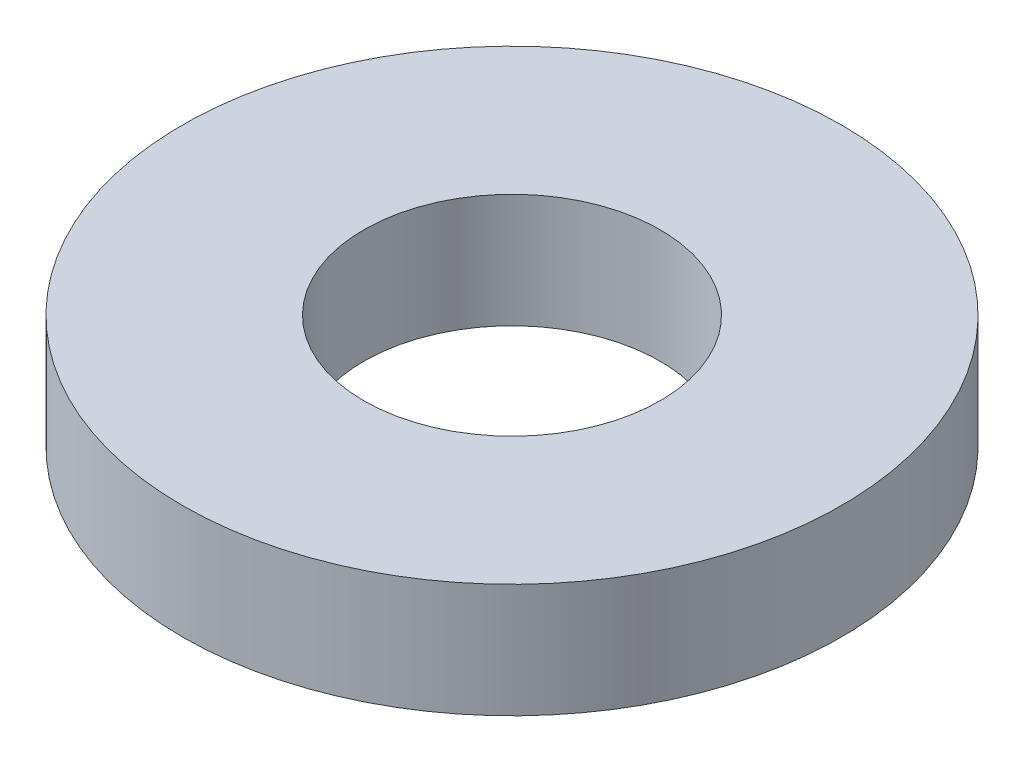
ISO-10303-21;
HEADER;
FILE_DESCRIPTION(('STEP AP214'),'2;1');
FILE_NAME('part.step','',(''),(''),'','','');
FILE_SCHEMA(('AUTOMOTIVE_DESIGN { 1 0 10303 214 1 1 1 1 }'));
ENDSEC;
DATA;
#1=APPLICATION_CONTEXT('core data for automotive mechanical design processes');
#2=APPLICATION_PROTOCOL_DEFINITION('international standard','automotive_design',2000,#1);
#3=PRODUCT_CONTEXT('',#1,'mechanical');
#4=PRODUCT('Part','Part','',(#3));
#5=PRODUCT_RELATED_PRODUCT_CATEGORY('part','',(#4));
#6=PRODUCT_DEFINITION_FORMATION('','',#4);
#7=PRODUCT_DEFINITION_CONTEXT('part definition',#1,'design');
#8=PRODUCT_DEFINITION('design','',#6,#7);
#9=PRODUCT_DEFINITION_SHAPE('','',#8);
#10=(LENGTH_UNIT() NAMED_UNIT(*) SI_UNIT(.MILLI.,.METRE.));
#11=(NAMED_UNIT(*) PLANE_ANGLE_UNIT() SI_UNIT($,.RADIAN.));
#12=(NAMED_UNIT(*) SI_UNIT($,.STERADIAN.) SOLID_ANGLE_UNIT());
#13=UNCERTAINTY_MEASURE_WITH_UNIT(LENGTH_MEASURE(1.E-05),#10,'distance_accuracy_value','');
#14=(GEOMETRIC_REPRESENTATION_CONTEXT(3) GLOBAL_UNCERTAINTY_ASSIGNED_CONTEXT((#13)) GLOBAL_UNIT_ASSIGNED_CONTEXT((#10,
#11,#12)) REPRESENTATION_CONTEXT('',''));
#15=CARTESIAN_POINT('',(0.,0.,0.));
#16=DIRECTION('',(0.,0.,1.));
#17=DIRECTION('',(1.,0.,0.));
#18=AXIS2_PLACEMENT_3D('',#15,#16,#17);
#19=CARTESIAN_POINT('',(0.,2.7432,0.));
#20=DIRECTION('',(0.,1.,0.));
#21=DIRECTION('',(0.,0.,1.));
#22=AXIS2_PLACEMENT_3D('',#19,#20,#21);
#23=PLANE('',#22);
#24=CARTESIAN_POINT('',(0.,2.7432,0.));
#25=DIRECTION('',(0.,1.,0.));
#26=DIRECTION('',(0.,0.,1.));
#27=AXIS2_PLACEMENT_3D('',#24,#25,#26);
#28=CIRCLE('',#27,7.9375);
#29=CARTESIAN_POINT('',(0.,2.7432,7.9375));
#30=VERTEX_POINT('',#29);
#31=EDGE_CURVE('E10',#30,#30,#28,.T.);
#32=ORIENTED_EDGE('',*,*,#31,.T.);
#33=EDGE_LOOP('',(#32));
#34=FACE_BOUND('',#33,.T.);
#35=CARTESIAN_POINT('',(0.,2.7432,0.));
#36=DIRECTION('',(0.,1.,0.));
#37=DIRECTION('',(0.,0.,1.));
#38=AXIS2_PLACEMENT_3D('',#35,#36,#37);
#39=CIRCLE('',#38,3.5687);
#40=CARTESIAN_POINT('',(0.,2.7432,3.5687));
#41=VERTEX_POINT('',#40);
#42=EDGE_CURVE('E43',#41,#41,#39,.T.);
#43=ORIENTED_EDGE('',*,*,#42,.F.);
#44=EDGE_LOOP('',(#43));
#45=FACE_BOUND('',#44,.T.);
#46=ADVANCED_FACE('F32',(#34,#45),#23,.T.);
#47=CARTESIAN_POINT('',(0.,0.,0.));
#48=DIRECTION('',(0.,1.,0.));
#49=DIRECTION('',(0.,0.,1.));
#50=AXIS2_PLACEMENT_3D('',#47,#48,#49);
#51=PLANE('',#50);
#52=CARTESIAN_POINT('',(0.,0.,0.));
#53=DIRECTION('',(0.,1.,0.));
#54=DIRECTION('',(0.,0.,1.));
#55=AXIS2_PLACEMENT_3D('',#52,#53,#54);
#56=CIRCLE('',#55,7.9375);
#57=CARTESIAN_POINT('',(0.,0.,7.9375));
#58=VERTEX_POINT('',#57);
#59=EDGE_CURVE('E36',#58,#58,#56,.T.);
#60=ORIENTED_EDGE('',*,*,#59,.F.);
#61=EDGE_LOOP('',(#60));
#62=FACE_BOUND('',#61,.T.);
#63=CARTESIAN_POINT('',(0.,0.,0.));
#64=DIRECTION('',(0.,1.,0.));
#65=DIRECTION('',(0.,0.,1.));
#66=AXIS2_PLACEMENT_3D('',#63,#64,#65);
#67=CIRCLE('',#66,3.5687);
#68=CARTESIAN_POINT('',(0.,0.,3.5687));
#69=VERTEX_POINT('',#68);
#70=EDGE_CURVE('E45',#69,#69,#67,.T.);
#71=ORIENTED_EDGE('',*,*,#70,.T.);
#72=EDGE_LOOP('',(#71));
#73=FACE_BOUND('',#72,.T.);
#74=ADVANCED_FACE('F55',(#62,#73),#51,.F.);
#75=CARTESIAN_POINT('',(0.,2.7432,0.));
#76=DIRECTION('',(0.,-1.,0.));
#77=DIRECTION('',(0.,0.,-1.));
#78=AXIS2_PLACEMENT_3D('',#75,#76,#77);
#79=CYLINDRICAL_SURFACE('',#78,7.9375);
#80=ORIENTED_EDGE('',*,*,#31,.F.);
#81=EDGE_LOOP('',(#80));
#82=FACE_BOUND('',#81,.T.);
#83=ORIENTED_EDGE('',*,*,#59,.T.);
#84=EDGE_LOOP('',(#83));
#85=FACE_BOUND('',#84,.T.);
#86=ADVANCED_FACE('F34',(#82,#85),#79,.T.);
#87=CARTESIAN_POINT('',(0.,2.7432,0.));
#88=DIRECTION('',(0.,-1.,0.));
#89=DIRECTION('',(0.,0.,-1.));
#90=AXIS2_PLACEMENT_3D('',#87,#88,#89);
#91=CYLINDRICAL_SURFACE('',#90,3.5687);
#92=ORIENTED_EDGE('',*,*,#42,.T.);
#93=EDGE_LOOP('',(#92));
#94=FACE_BOUND('',#93,.T.);
#95=ORIENTED_EDGE('',*,*,#70,.F.);
#96=EDGE_LOOP('',(#95));
#97=FACE_BOUND('',#96,.T.);
#98=ADVANCED_FACE('F51',(#94,#97),#91,.F.);
#99=CLOSED_SHELL('',(#46,#74,#86,#98));
#100=MANIFOLD_SOLID_BREP('B2',#99);
#101=ADVANCED_BREP_SHAPE_REPRESENTATION('',(#18,#100),#14);
#102=SHAPE_DEFINITION_REPRESENTATION(#9,#101);
ENDSEC;
END-ISO-10303-21;
